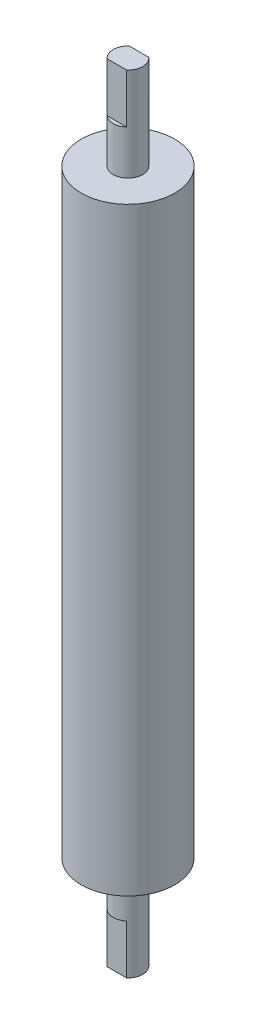
ISO-10303-21;
HEADER;
FILE_DESCRIPTION(('STEP AP214'),'2;1');
FILE_NAME('part.step','',(''),(''),'','','');
FILE_SCHEMA(('AUTOMOTIVE_DESIGN { 1 0 10303 214 1 1 1 1 }'));
ENDSEC;
DATA;
#1=APPLICATION_CONTEXT('core data for automotive mechanical design processes');
#2=APPLICATION_PROTOCOL_DEFINITION('international standard','automotive_design',2000,#1);
#3=PRODUCT_CONTEXT('',#1,'mechanical');
#4=PRODUCT('Part','Part','',(#3));
#5=PRODUCT_RELATED_PRODUCT_CATEGORY('part','',(#4));
#6=PRODUCT_DEFINITION_FORMATION('','',#4);
#7=PRODUCT_DEFINITION_CONTEXT('part definition',#1,'design');
#8=PRODUCT_DEFINITION('design','',#6,#7);
#9=PRODUCT_DEFINITION_SHAPE('','',#8);
#10=(LENGTH_UNIT() NAMED_UNIT(*) SI_UNIT(.MILLI.,.METRE.));
#11=(NAMED_UNIT(*) PLANE_ANGLE_UNIT() SI_UNIT($,.RADIAN.));
#12=(NAMED_UNIT(*) SI_UNIT($,.STERADIAN.) SOLID_ANGLE_UNIT());
#13=UNCERTAINTY_MEASURE_WITH_UNIT(LENGTH_MEASURE(1.E-05),#10,'distance_accuracy_value','');
#14=(GEOMETRIC_REPRESENTATION_CONTEXT(3) GLOBAL_UNCERTAINTY_ASSIGNED_CONTEXT((#13)) GLOBAL_UNIT_ASSIGNED_CONTEXT((#10,
#11,#12)) REPRESENTATION_CONTEXT('',''));
#15=CARTESIAN_POINT('',(0.,0.,0.));
#16=DIRECTION('',(0.,0.,1.));
#17=DIRECTION('',(1.,0.,0.));
#18=AXIS2_PLACEMENT_3D('',#15,#16,#17);
#19=CARTESIAN_POINT('',(0.,-26.67,0.));
#20=DIRECTION('',(0.,1.,0.));
#21=DIRECTION('',(0.,0.,1.));
#22=AXIS2_PLACEMENT_3D('',#19,#20,#21);
#23=CYLINDRICAL_SURFACE('',#22,1.);
#24=DIRECTION('',(0.,1.,0.));
#25=VECTOR('',#24,1.);
#26=CARTESIAN_POINT('',(0.661437827766147,-29.670000096,-0.750000000000001));
#27=LINE('',#26,#25);
#28=CARTESIAN_POINT('',(0.661437827766147,-26.67,-0.750000000000001));
#29=VERTEX_POINT('',#28);
#30=CARTESIAN_POINT('',(0.661437827766147,-23.320000096,-0.750000000000001));
#31=VERTEX_POINT('',#30);
#32=EDGE_CURVE('E62',#29,#31,#27,.T.);
#33=ORIENTED_EDGE('',*,*,#32,.T.);
#34=CARTESIAN_POINT('',(0.,-23.320000096,0.));
#35=DIRECTION('',(0.,1.,0.));
#36=DIRECTION('',(0.,0.,1.));
#37=AXIS2_PLACEMENT_3D('',#34,#35,#36);
#38=CIRCLE('',#37,1.);
#39=CARTESIAN_POINT('',(-0.661437827766147,-23.320000096,-0.750000000000001));
#40=VERTEX_POINT('',#39);
#41=EDGE_CURVE('E116',#31,#40,#38,.T.);
#42=ORIENTED_EDGE('',*,*,#41,.T.);
#43=DIRECTION('',(0.,1.,0.));
#44=VECTOR('',#43,1.);
#45=CARTESIAN_POINT('',(-0.661437827766147,-29.670000096,-0.750000000000001));
#46=LINE('',#45,#44);
#47=CARTESIAN_POINT('',(-0.661437827766147,-26.67,-0.750000000000001));
#48=VERTEX_POINT('',#47);
#49=EDGE_CURVE('E102',#48,#40,#46,.T.);
#50=ORIENTED_EDGE('',*,*,#49,.F.);
#51=CARTESIAN_POINT('',(0.,-26.67,0.));
#52=DIRECTION('',(0.,1.,0.));
#53=DIRECTION('',(0.,0.,1.));
#54=AXIS2_PLACEMENT_3D('',#51,#52,#53);
#55=CIRCLE('',#54,1.);
#56=CARTESIAN_POINT('',(-0.661437827766147,-26.67,0.750000000000001));
#57=VERTEX_POINT('',#56);
#58=EDGE_CURVE('E143',#48,#57,#55,.T.);
#59=ORIENTED_EDGE('',*,*,#58,.T.);
#60=DIRECTION('',(0.,1.,0.));
#61=VECTOR('',#60,1.);
#62=CARTESIAN_POINT('',(-0.661437827766147,-29.670000096,0.750000000000001));
#63=LINE('',#62,#61);
#64=CARTESIAN_POINT('',(-0.661437827766147,-23.320000096,0.750000000000001));
#65=VERTEX_POINT('',#64);
#66=EDGE_CURVE('E55',#57,#65,#63,.T.);
#67=ORIENTED_EDGE('',*,*,#66,.T.);
#68=CARTESIAN_POINT('',(0.,-23.320000096,0.));
#69=DIRECTION('',(0.,1.,0.));
#70=DIRECTION('',(0.,0.,1.));
#71=AXIS2_PLACEMENT_3D('',#68,#69,#70);
#72=CIRCLE('',#71,1.);
#73=CARTESIAN_POINT('',(0.661437827766147,-23.320000096,0.750000000000001));
#74=VERTEX_POINT('',#73);
#75=EDGE_CURVE('E131',#65,#74,#72,.T.);
#76=ORIENTED_EDGE('',*,*,#75,.T.);
#77=DIRECTION('',(0.,1.,0.));
#78=VECTOR('',#77,1.);
#79=CARTESIAN_POINT('',(0.661437827766147,-29.670000096,0.750000000000001));
#80=LINE('',#79,#78);
#81=CARTESIAN_POINT('',(0.661437827766147,-26.67,0.750000000000001));
#82=VERTEX_POINT('',#81);
#83=EDGE_CURVE('E118',#82,#74,#80,.T.);
#84=ORIENTED_EDGE('',*,*,#83,.F.);
#85=EDGE_CURVE('E139',#82,#29,#55,.T.);
#86=ORIENTED_EDGE('',*,*,#85,.T.);
#87=EDGE_LOOP('',(#33,#42,#50,#59,#67,#76,#84,#86));
#88=FACE_BOUND('',#87,.T.);
#89=CARTESIAN_POINT('',(0.,-20.32,0.));
#90=DIRECTION('',(0.,1.,0.));
#91=DIRECTION('',(0.,0.,1.));
#92=AXIS2_PLACEMENT_3D('',#89,#90,#91);
#93=CIRCLE('',#92,1.);
#94=CARTESIAN_POINT('',(0.,-20.32,1.));
#95=VERTEX_POINT('',#94);
#96=EDGE_CURVE('E112',#95,#95,#93,.T.);
#97=ORIENTED_EDGE('',*,*,#96,.F.);
#98=EDGE_LOOP('',(#97));
#99=FACE_BOUND('',#98,.T.);
#100=ADVANCED_FACE('F39',(#88,#99),#23,.T.);
#101=CARTESIAN_POINT('',(0.,-26.67,0.));
#102=DIRECTION('',(0.,-1.,0.));
#103=DIRECTION('',(0.,0.,1.));
#104=AXIS2_PLACEMENT_3D('',#101,#102,#103);
#105=PLANE('',#104);
#106=DIRECTION('',(-1.,0.,0.));
#107=VECTOR('',#106,1.);
#108=CARTESIAN_POINT('',(0.,-26.67,-0.750000000000001));
#109=LINE('',#108,#107);
#110=EDGE_CURVE('E11',#29,#48,#109,.T.);
#111=ORIENTED_EDGE('',*,*,#110,.F.);
#112=ORIENTED_EDGE('',*,*,#85,.F.);
#113=DIRECTION('',(-1.,0.,0.));
#114=VECTOR('',#113,1.);
#115=CARTESIAN_POINT('',(0.,-26.67,0.750000000000001));
#116=LINE('',#115,#114);
#117=EDGE_CURVE('E48',#82,#57,#116,.T.);
#118=ORIENTED_EDGE('',*,*,#117,.T.);
#119=ORIENTED_EDGE('',*,*,#58,.F.);
#120=EDGE_LOOP('',(#111,#112,#118,#119));
#121=FACE_BOUND('',#120,.T.);
#122=ADVANCED_FACE('F200',(#121),#105,.T.);
#123=CARTESIAN_POINT('',(0.,26.67,0.));
#124=DIRECTION('',(0.,-1.,0.));
#125=DIRECTION('',(0.,0.,-1.));
#126=AXIS2_PLACEMENT_3D('',#123,#124,#125);
#127=CYLINDRICAL_SURFACE('',#126,1.);
#128=CARTESIAN_POINT('',(0.,20.32,0.));
#129=DIRECTION('',(0.,1.,0.));
#130=DIRECTION('',(0.,0.,1.));
#131=AXIS2_PLACEMENT_3D('',#128,#129,#130);
#132=CIRCLE('',#131,1.);
#133=CARTESIAN_POINT('',(0.,20.32,1.));
#134=VERTEX_POINT('',#133);
#135=EDGE_CURVE('E180',#134,#134,#132,.T.);
#136=ORIENTED_EDGE('',*,*,#135,.T.);
#137=EDGE_LOOP('',(#136));
#138=FACE_BOUND('',#137,.T.);
#139=DIRECTION('',(0.,-1.,0.));
#140=VECTOR('',#139,1.);
#141=CARTESIAN_POINT('',(0.661437827766147,29.670000096,-0.750000000000001));
#142=LINE('',#141,#140);
#143=CARTESIAN_POINT('',(0.661437827766147,26.67,-0.750000000000001));
#144=VERTEX_POINT('',#143);
#145=CARTESIAN_POINT('',(0.661437827766147,23.320000096,-0.750000000000001));
#146=VERTEX_POINT('',#145);
#147=EDGE_CURVE('E159',#144,#146,#142,.T.);
#148=ORIENTED_EDGE('',*,*,#147,.F.);
#149=CARTESIAN_POINT('',(0.,26.67,0.));
#150=DIRECTION('',(0.,1.,0.));
#151=DIRECTION('',(0.,0.,1.));
#152=AXIS2_PLACEMENT_3D('',#149,#150,#151);
#153=CIRCLE('',#152,1.);
#154=CARTESIAN_POINT('',(0.661437827766147,26.67,0.750000000000001));
#155=VERTEX_POINT('',#154);
#156=EDGE_CURVE('E175',#155,#144,#153,.T.);
#157=ORIENTED_EDGE('',*,*,#156,.F.);
#158=DIRECTION('',(0.,-1.,0.));
#159=VECTOR('',#158,1.);
#160=CARTESIAN_POINT('',(0.661437827766147,29.670000096,0.750000000000001));
#161=LINE('',#160,#159);
#162=CARTESIAN_POINT('',(0.661437827766147,23.320000096,0.750000000000001));
#163=VERTEX_POINT('',#162);
#164=EDGE_CURVE('E169',#155,#163,#161,.T.);
#165=ORIENTED_EDGE('',*,*,#164,.T.);
#166=CARTESIAN_POINT('',(0.,23.320000096,0.));
#167=DIRECTION('',(0.,1.,0.));
#168=DIRECTION('',(0.,0.,1.));
#169=AXIS2_PLACEMENT_3D('',#166,#167,#168);
#170=CIRCLE('',#169,1.);
#171=CARTESIAN_POINT('',(-0.661437827766147,23.320000096,0.750000000000001));
#172=VERTEX_POINT('',#171);
#173=EDGE_CURVE('E166',#172,#163,#170,.T.);
#174=ORIENTED_EDGE('',*,*,#173,.F.);
#175=DIRECTION('',(0.,-1.,0.));
#176=VECTOR('',#175,1.);
#177=CARTESIAN_POINT('',(-0.661437827766147,29.670000096,0.750000000000001));
#178=LINE('',#177,#176);
#179=CARTESIAN_POINT('',(-0.661437827766147,26.67,0.750000000000001));
#180=VERTEX_POINT('',#179);
#181=EDGE_CURVE('E152',#180,#172,#178,.T.);
#182=ORIENTED_EDGE('',*,*,#181,.F.);
#183=CARTESIAN_POINT('',(-0.661437827766147,26.67,-0.750000000000001));
#184=VERTEX_POINT('',#183);
#185=EDGE_CURVE('E162',#184,#180,#153,.T.);
#186=ORIENTED_EDGE('',*,*,#185,.F.);
#187=DIRECTION('',(0.,-1.,0.));
#188=VECTOR('',#187,1.);
#189=CARTESIAN_POINT('',(-0.661437827766147,29.670000096,-0.750000000000001));
#190=LINE('',#189,#188);
#191=CARTESIAN_POINT('',(-0.661437827766147,23.320000096,-0.750000000000001));
#192=VERTEX_POINT('',#191);
#193=EDGE_CURVE('E155',#184,#192,#190,.T.);
#194=ORIENTED_EDGE('',*,*,#193,.T.);
#195=CARTESIAN_POINT('',(0.,23.320000096,0.));
#196=DIRECTION('',(0.,1.,0.));
#197=DIRECTION('',(0.,0.,1.));
#198=AXIS2_PLACEMENT_3D('',#195,#196,#197);
#199=CIRCLE('',#198,1.);
#200=EDGE_CURVE('E151',#146,#192,#199,.T.);
#201=ORIENTED_EDGE('',*,*,#200,.F.);
#202=EDGE_LOOP('',(#148,#157,#165,#174,#182,#186,#194,#201));
#203=FACE_BOUND('',#202,.T.);
#204=ADVANCED_FACE('F213',(#138,#203),#127,.T.);
#205=CARTESIAN_POINT('',(0.,26.67,0.));
#206=DIRECTION('',(0.,1.,0.));
#207=DIRECTION('',(0.,0.,1.));
#208=AXIS2_PLACEMENT_3D('',#205,#206,#207);
#209=PLANE('',#208);
#210=ORIENTED_EDGE('',*,*,#156,.T.);
#211=DIRECTION('',(-1.,0.,0.));
#212=VECTOR('',#211,1.);
#213=CARTESIAN_POINT('',(0.,26.67,-0.750000000000001));
#214=LINE('',#213,#212);
#215=EDGE_CURVE('E194',#144,#184,#214,.T.);
#216=ORIENTED_EDGE('',*,*,#215,.T.);
#217=ORIENTED_EDGE('',*,*,#185,.T.);
#218=DIRECTION('',(-1.,0.,0.));
#219=VECTOR('',#218,1.);
#220=CARTESIAN_POINT('',(0.,26.67,0.750000000000001));
#221=LINE('',#220,#219);
#222=EDGE_CURVE('E184',#155,#180,#221,.T.);
#223=ORIENTED_EDGE('',*,*,#222,.F.);
#224=EDGE_LOOP('',(#210,#216,#217,#223));
#225=FACE_BOUND('',#224,.T.);
#226=ADVANCED_FACE('F208',(#225),#209,.T.);
#227=CARTESIAN_POINT('',(0.,-20.32,0.));
#228=DIRECTION('',(0.,1.,0.));
#229=DIRECTION('',(0.,0.,1.));
#230=AXIS2_PLACEMENT_3D('',#227,#228,#229);
#231=CYLINDRICAL_SURFACE('',#230,3.175);
#232=CARTESIAN_POINT('',(0.,-20.32,0.));
#233=DIRECTION('',(0.,1.,0.));
#234=DIRECTION('',(0.,0.,1.));
#235=AXIS2_PLACEMENT_3D('',#232,#233,#234);
#236=CIRCLE('',#235,3.175);
#237=CARTESIAN_POINT('',(0.,-20.32,3.175));
#238=VERTEX_POINT('',#237);
#239=EDGE_CURVE('E185',#238,#238,#236,.T.);
#240=ORIENTED_EDGE('',*,*,#239,.T.);
#241=EDGE_LOOP('',(#240));
#242=FACE_BOUND('',#241,.T.);
#243=CARTESIAN_POINT('',(0.,20.32,0.));
#244=DIRECTION('',(0.,1.,0.));
#245=DIRECTION('',(0.,0.,1.));
#246=AXIS2_PLACEMENT_3D('',#243,#244,#245);
#247=CIRCLE('',#246,3.175);
#248=CARTESIAN_POINT('',(0.,20.32,3.175));
#249=VERTEX_POINT('',#248);
#250=EDGE_CURVE('E179',#249,#249,#247,.T.);
#251=ORIENTED_EDGE('',*,*,#250,.F.);
#252=EDGE_LOOP('',(#251));
#253=FACE_BOUND('',#252,.T.);
#254=ADVANCED_FACE('F41',(#242,#253),#231,.T.);
#255=CARTESIAN_POINT('',(0.,-20.32,0.));
#256=DIRECTION('',(0.,1.,0.));
#257=DIRECTION('',(0.,0.,1.));
#258=AXIS2_PLACEMENT_3D('',#255,#256,#257);
#259=PLANE('',#258);
#260=ORIENTED_EDGE('',*,*,#96,.T.);
#261=EDGE_LOOP('',(#260));
#262=FACE_BOUND('',#261,.T.);
#263=ORIENTED_EDGE('',*,*,#239,.F.);
#264=EDGE_LOOP('',(#263));
#265=FACE_BOUND('',#264,.T.);
#266=ADVANCED_FACE('F279',(#262,#265),#259,.F.);
#267=CARTESIAN_POINT('',(0.,20.32,0.));
#268=DIRECTION('',(0.,1.,0.));
#269=DIRECTION('',(0.,0.,1.));
#270=AXIS2_PLACEMENT_3D('',#267,#268,#269);
#271=PLANE('',#270);
#272=ORIENTED_EDGE('',*,*,#135,.F.);
#273=EDGE_LOOP('',(#272));
#274=FACE_BOUND('',#273,.T.);
#275=ORIENTED_EDGE('',*,*,#250,.T.);
#276=EDGE_LOOP('',(#275));
#277=FACE_BOUND('',#276,.T.);
#278=ADVANCED_FACE('F231',(#274,#277),#271,.T.);
#279=CARTESIAN_POINT('',(0.,29.670000096,0.750000000000001));
#280=DIRECTION('',(0.,0.,-1.));
#281=DIRECTION('',(-1.,0.,0.));
#282=AXIS2_PLACEMENT_3D('',#279,#280,#281);
#283=PLANE('',#282);
#284=ORIENTED_EDGE('',*,*,#222,.T.);
#285=ORIENTED_EDGE('',*,*,#181,.T.);
#286=DIRECTION('',(1.,0.,0.));
#287=VECTOR('',#286,1.);
#288=CARTESIAN_POINT('',(0.,23.320000096,0.750000000000001));
#289=LINE('',#288,#287);
#290=EDGE_CURVE('E142',#172,#163,#289,.T.);
#291=ORIENTED_EDGE('',*,*,#290,.T.);
#292=ORIENTED_EDGE('',*,*,#164,.F.);
#293=EDGE_LOOP('',(#284,#285,#291,#292));
#294=FACE_BOUND('',#293,.T.);
#295=ADVANCED_FACE('F218',(#294),#283,.F.);
#296=CARTESIAN_POINT('',(0.,23.320000096,0.));
#297=DIRECTION('',(0.,1.,0.));
#298=DIRECTION('',(0.,0.,1.));
#299=AXIS2_PLACEMENT_3D('',#296,#297,#298);
#300=PLANE('',#299);
#301=ORIENTED_EDGE('',*,*,#290,.F.);
#302=ORIENTED_EDGE('',*,*,#173,.T.);
#303=EDGE_LOOP('',(#301,#302));
#304=FACE_BOUND('',#303,.T.);
#305=ADVANCED_FACE('F220',(#304),#300,.T.);
#306=CARTESIAN_POINT('',(0.,29.670000096,-0.750000000000001));
#307=DIRECTION('',(0.,0.,-1.));
#308=DIRECTION('',(-1.,0.,0.));
#309=AXIS2_PLACEMENT_3D('',#306,#307,#308);
#310=PLANE('',#309);
#311=ORIENTED_EDGE('',*,*,#147,.T.);
#312=DIRECTION('',(1.,0.,0.));
#313=VECTOR('',#312,1.);
#314=CARTESIAN_POINT('',(0.,23.320000096,-0.750000000000001));
#315=LINE('',#314,#313);
#316=EDGE_CURVE('E147',#192,#146,#315,.T.);
#317=ORIENTED_EDGE('',*,*,#316,.F.);
#318=ORIENTED_EDGE('',*,*,#193,.F.);
#319=ORIENTED_EDGE('',*,*,#215,.F.);
#320=EDGE_LOOP('',(#311,#317,#318,#319));
#321=FACE_BOUND('',#320,.T.);
#322=ADVANCED_FACE('F222',(#321),#310,.T.);
#323=CARTESIAN_POINT('',(0.,23.320000096,0.));
#324=DIRECTION('',(0.,1.,0.));
#325=DIRECTION('',(0.,0.,1.));
#326=AXIS2_PLACEMENT_3D('',#323,#324,#325);
#327=PLANE('',#326);
#328=ORIENTED_EDGE('',*,*,#316,.T.);
#329=ORIENTED_EDGE('',*,*,#200,.T.);
#330=EDGE_LOOP('',(#328,#329));
#331=FACE_BOUND('',#330,.T.);
#332=ADVANCED_FACE('F228',(#331),#327,.T.);
#333=CARTESIAN_POINT('',(0.,-29.670000096,0.750000000000001));
#334=DIRECTION('',(0.,0.,1.));
#335=DIRECTION('',(1.,0.,0.));
#336=AXIS2_PLACEMENT_3D('',#333,#334,#335);
#337=PLANE('',#336);
#338=ORIENTED_EDGE('',*,*,#83,.T.);
#339=DIRECTION('',(1.,0.,0.));
#340=VECTOR('',#339,1.);
#341=CARTESIAN_POINT('',(0.,-23.320000096,0.750000000000001));
#342=LINE('',#341,#340);
#343=EDGE_CURVE('E127',#65,#74,#342,.T.);
#344=ORIENTED_EDGE('',*,*,#343,.F.);
#345=ORIENTED_EDGE('',*,*,#66,.F.);
#346=ORIENTED_EDGE('',*,*,#117,.F.);
#347=EDGE_LOOP('',(#338,#344,#345,#346));
#348=FACE_BOUND('',#347,.T.);
#349=ADVANCED_FACE('F243',(#348),#337,.T.);
#350=CARTESIAN_POINT('',(0.,-23.320000096,0.));
#351=DIRECTION('',(0.,-1.,0.));
#352=DIRECTION('',(0.,0.,1.));
#353=AXIS2_PLACEMENT_3D('',#350,#351,#352);
#354=PLANE('',#353);
#355=ORIENTED_EDGE('',*,*,#343,.T.);
#356=ORIENTED_EDGE('',*,*,#75,.F.);
#357=EDGE_LOOP('',(#355,#356));
#358=FACE_BOUND('',#357,.T.);
#359=ADVANCED_FACE('F248',(#358),#354,.T.);
#360=CARTESIAN_POINT('',(0.,-29.670000096,-0.750000000000001));
#361=DIRECTION('',(0.,0.,1.));
#362=DIRECTION('',(1.,0.,0.));
#363=AXIS2_PLACEMENT_3D('',#360,#361,#362);
#364=PLANE('',#363);
#365=ORIENTED_EDGE('',*,*,#110,.T.);
#366=ORIENTED_EDGE('',*,*,#49,.T.);
#367=DIRECTION('',(1.,0.,0.));
#368=VECTOR('',#367,1.);
#369=CARTESIAN_POINT('',(0.,-23.320000096,-0.750000000000001));
#370=LINE('',#369,#368);
#371=EDGE_CURVE('E105',#40,#31,#370,.T.);
#372=ORIENTED_EDGE('',*,*,#371,.T.);
#373=ORIENTED_EDGE('',*,*,#32,.F.);
#374=EDGE_LOOP('',(#365,#366,#372,#373));
#375=FACE_BOUND('',#374,.T.);
#376=ADVANCED_FACE('F104',(#375),#364,.F.);
#377=CARTESIAN_POINT('',(0.,-23.320000096,0.));
#378=DIRECTION('',(0.,-1.,0.));
#379=DIRECTION('',(0.,0.,1.));
#380=AXIS2_PLACEMENT_3D('',#377,#378,#379);
#381=PLANE('',#380);
#382=ORIENTED_EDGE('',*,*,#371,.F.);
#383=ORIENTED_EDGE('',*,*,#41,.F.);
#384=EDGE_LOOP('',(#382,#383));
#385=FACE_BOUND('',#384,.T.);
#386=ADVANCED_FACE('F115',(#385),#381,.T.);
#387=CLOSED_SHELL('',(#100,#122,#204,#226,#254,#266,#278,#295,#305,#322,#332,#349,#359,#376,#386));
#388=MANIFOLD_SOLID_BREP('B2',#387);
#389=ADVANCED_BREP_SHAPE_REPRESENTATION('',(#18,#388),#14);
#390=SHAPE_DEFINITION_REPRESENTATION(#9,#389);
ENDSEC;
END-ISO-10303-21;
